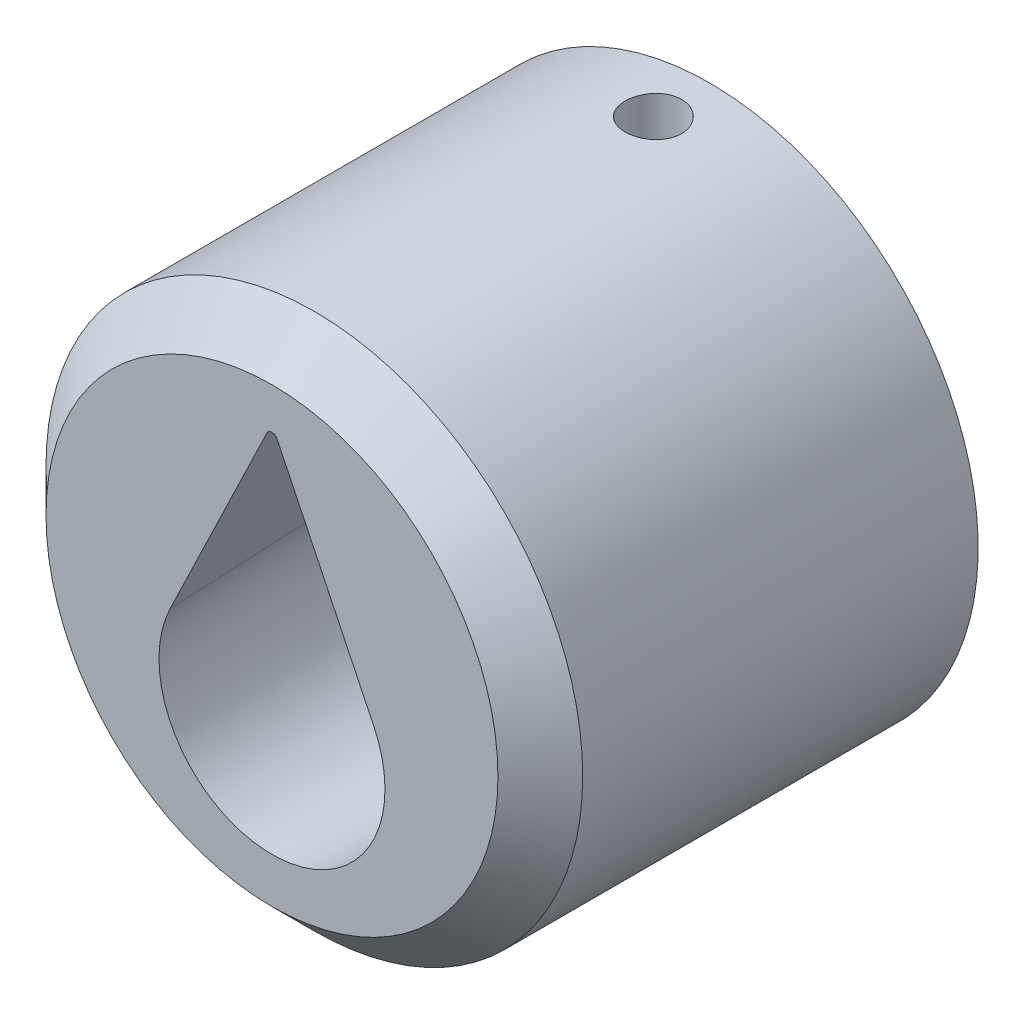
ISO-10303-21;
HEADER;
FILE_DESCRIPTION(('STEP AP214'),'2;1');
FILE_NAME('part.step','',(''),(''),'','','');
FILE_SCHEMA(('AUTOMOTIVE_DESIGN { 1 0 10303 214 1 1 1 1 }'));
ENDSEC;
DATA;
#1=APPLICATION_CONTEXT('core data for automotive mechanical design processes');
#2=APPLICATION_PROTOCOL_DEFINITION('international standard','automotive_design',2000,#1);
#3=PRODUCT_CONTEXT('',#1,'mechanical');
#4=PRODUCT('Part','Part','',(#3));
#5=PRODUCT_RELATED_PRODUCT_CATEGORY('part','',(#4));
#6=PRODUCT_DEFINITION_FORMATION('','',#4);
#7=PRODUCT_DEFINITION_CONTEXT('part definition',#1,'design');
#8=PRODUCT_DEFINITION('design','',#6,#7);
#9=PRODUCT_DEFINITION_SHAPE('','',#8);
#10=(LENGTH_UNIT() NAMED_UNIT(*) SI_UNIT(.MILLI.,.METRE.));
#11=(NAMED_UNIT(*) PLANE_ANGLE_UNIT() SI_UNIT($,.RADIAN.));
#12=(NAMED_UNIT(*) SI_UNIT($,.STERADIAN.) SOLID_ANGLE_UNIT());
#13=UNCERTAINTY_MEASURE_WITH_UNIT(LENGTH_MEASURE(1.E-05),#10,'distance_accuracy_value','');
#14=(GEOMETRIC_REPRESENTATION_CONTEXT(3) GLOBAL_UNCERTAINTY_ASSIGNED_CONTEXT((#13)) GLOBAL_UNIT_ASSIGNED_CONTEXT((#10,
#11,#12)) REPRESENTATION_CONTEXT('',''));
#15=CARTESIAN_POINT('',(0.,0.,0.));
#16=DIRECTION('',(0.,0.,1.));
#17=DIRECTION('',(1.,0.,0.));
#18=AXIS2_PLACEMENT_3D('',#15,#16,#17);
#19=CARTESIAN_POINT('',(0.,3.17,1.36960721857804));
#20=DIRECTION('',(0.,0.,-1.));
#21=DIRECTION('',(-1.,0.,0.));
#22=AXIS2_PLACEMENT_3D('',#19,#20,#21);
#23=CONICAL_SURFACE('',#22,0.322808225586613,0.0349065850402013);
#24=CARTESIAN_POINT('',(0.289503548245727,3.30977363021477,1.40766125098313));
#25=CARTESIAN_POINT('',(0.281010976513092,3.32683568107946,1.41370671628476));
#26=CARTESIAN_POINT('',(0.271109988403632,3.34295551904441,1.42032696377866));
#27=CARTESIAN_POINT('',(0.248677947118351,3.37316705283377,1.43396834605201));
#28=CARTESIAN_POINT('',(0.23613706423505,3.38725082710312,1.44099090564664));
#29=CARTESIAN_POINT('',(0.208686963801339,3.41310734779046,1.45462708367945));
#30=CARTESIAN_POINT('',(0.19377897678483,3.42488128790014,1.4612409121275));
#31=CARTESIAN_POINT('',(0.161828670976606,3.4457774367839,1.47339442192647));
#32=CARTESIAN_POINT('',(0.14478943054501,3.45490340838251,1.47893562373769));
#33=CARTESIAN_POINT('',(0.109787174966618,3.46973500877186,1.48811737903807));
#34=CARTESIAN_POINT('',(0.0919042756431988,3.47558027564039,1.49183450615142));
#35=CARTESIAN_POINT('',(0.0551141459244364,3.48410777679032,1.49729925035043));
#36=CARTESIAN_POINT('',(0.0362082275810521,3.48679396661385,1.49904933029241));
#37=CARTESIAN_POINT('',(0.00105415561990478,3.48865459959268,1.50026021785506));
#38=CARTESIAN_POINT('',(-0.0151603269913705,3.48830150558641,1.500029042902));
#39=CARTESIAN_POINT('',(-0.0472596223392381,3.48520850799322,1.4980209307988));
#40=CARTESIAN_POINT('',(-0.0631444788298692,3.48246892328709,1.49624420016449));
#41=CARTESIAN_POINT('',(-0.0935024984211748,3.47490907028782,1.49141063917163));
#42=CARTESIAN_POINT('',(-0.108006743525232,3.47017691547354,1.48840816650877));
#43=CARTESIAN_POINT('',(-0.135996248008937,3.45884924590151,1.48136631259266));
#44=CARTESIAN_POINT('',(-0.149481157363488,3.45225309472555,1.47732657723329));
#45=CARTESIAN_POINT('',(-0.176564619661506,3.43663116226765,1.46802845888353));
#46=CARTESIAN_POINT('',(-0.190029712699991,3.42742426952316,1.46268711128333));
#47=CARTESIAN_POINT('',(-0.215300524265339,3.40722350331987,1.45148322318052));
#48=CARTESIAN_POINT('',(-0.227105393976845,3.39622872192399,1.4456204185572));
#49=CARTESIAN_POINT('',(-0.248269037140414,3.37333656680272,1.4341635141443));
#50=CARTESIAN_POINT('',(-0.257732166477332,3.36153311924641,1.42857443525645));
#51=CARTESIAN_POINT('',(-0.27493565411919,3.33661476989699,1.41774996412032));
#52=CARTESIAN_POINT('',(-0.282678345520565,3.32350167955512,1.41251409967382));
#53=CARTESIAN_POINT('',(-0.289503548245727,3.30977363021477,1.40766125098313));
#54=B_SPLINE_CURVE_WITH_KNOTS('',3,(#24,#25,#26,#27,#28,#29,#30,#31,#32,#33,#34,#35,#36,#37,#38,
#39,#40,#41,#42,#43,#44,#45,#46,#47,#48,#49,#50,#51,#52,#53),.UNSPECIFIED.,.F.,.F.,(4,2,2,2,2,2,
2,2,2,2,2,2,2,2,4),(0.,0.0598633955449791,0.119953766602124,0.18001300147202,0.239986468051595,
0.297163591024114,0.354269044920385,0.402678805832384,0.45108209926652,0.497538681651625,
0.54401114476062,0.595306822489587,0.646628631338851,0.69486675846325,0.743039064822791),.UNSPECIFIED.);
#55=CARTESIAN_POINT('',(0.289503548246163,3.30977363021432,1.4076612509839));
#56=VERTEX_POINT('',#55);
#57=CARTESIAN_POINT('',(-0.289503548245974,3.30977363021456,1.40766125098296));
#58=VERTEX_POINT('',#57);
#59=EDGE_CURVE('E21',#56,#58,#54,.T.);
#60=ORIENTED_EDGE('',*,*,#59,.F.);
#61=DIRECTION('',(-0.0314282337055708,-0.0151736942184786,0.999390827019096));
#62=VECTOR('',#61,1.);
#63=CARTESIAN_POINT('',(0.0900535442487354,3.21347826086956,7.75));
#64=LINE('',#63,#62);
#65=CARTESIAN_POINT('',(0.0900535442489345,3.21347826086966,7.74999999999363));
#66=VERTEX_POINT('',#65);
#67=EDGE_CURVE('E79',#66,#56,#64,.F.);
#68=ORIENTED_EDGE('',*,*,#67,.F.);
#69=CARTESIAN_POINT('',(0.,3.17,7.74999999998727));
#70=DIRECTION('',(0.,0.,-1.));
#71=DIRECTION('',(-1.,0.,0.));
#72=AXIS2_PLACEMENT_3D('',#69,#70,#71);
#73=CIRCLE('',#72,0.0999999999981992);
#74=CARTESIAN_POINT('',(-0.0900535442489342,3.21347826086966,7.74999999999363));
#75=VERTEX_POINT('',#74);
#76=EDGE_CURVE('E178',#75,#66,#73,.T.);
#77=ORIENTED_EDGE('',*,*,#76,.F.);
#78=DIRECTION('',(0.0314282337055708,-0.0151736942184786,0.999390827019096));
#79=VECTOR('',#78,1.);
#80=CARTESIAN_POINT('',(-0.0900535442487341,3.21347826086956,7.75));
#81=LINE('',#80,#79);
#82=EDGE_CURVE('E83',#58,#75,#81,.T.);
#83=ORIENTED_EDGE('',*,*,#82,.F.);
#84=EDGE_LOOP('',(#60,#68,#77,#83));
#85=FACE_BOUND('',#84,.T.);
#86=ADVANCED_FACE('F17',(#85),#23,.F.);
#87=CARTESIAN_POINT('',(1.33122630628558,0.642722117202267,7.75));
#88=DIRECTION('',(-0.899986860627394,-0.434517750877867,-0.0348994967025009));
#89=DIRECTION('',(0.434782608695651,-0.900535442487304,0.));
#90=AXIS2_PLACEMENT_3D('',#87,#88,#89);
#91=PLANE('',#90);
#92=DIRECTION('',(0.434782608695653,-0.900535442487303,0.));
#93=VECTOR('',#92,1.);
#94=CARTESIAN_POINT('',(0.0900535442487305,3.21347826086956,7.75));
#95=LINE('',#94,#93);
#96=CARTESIAN_POINT('',(1.80107088497423,-0.330434782609057,7.75000000000466));
#97=VERTEX_POINT('',#96);
#98=EDGE_CURVE('E87',#66,#97,#95,.T.);
#99=ORIENTED_EDGE('',*,*,#98,.F.);
#100=ORIENTED_EDGE('',*,*,#67,.T.);
#101=CARTESIAN_POINT('',(0.,3.94214494635939,1.));
#102=DIRECTION('',(-0.899986860627394,-0.434517750877867,-0.0348994967025009));
#103=DIRECTION('',(0.434191423085883,-0.900663269025689,0.0168369815173485));
#104=AXIS2_PLACEMENT_3D('',#101,#102,#103);
#105=ELLIPSE('',#104,1.15070097594365,0.5);
#106=CARTESIAN_POINT('',(0.31454594570989,3.32186421364249,0.611334529358661));
#107=VERTEX_POINT('',#106);
#108=EDGE_CURVE('E72',#56,#107,#105,.F.);
#109=ORIENTED_EDGE('',*,*,#108,.T.);
#110=DIRECTION('',(-0.031428233705571,-0.0151736942184784,0.999390827019096));
#111=VECTOR('',#110,1.);
#112=CARTESIAN_POINT('',(15692.5816833393,7579.61983145452,-499000.));
#113=LINE('',#112,#111);
#114=CARTESIAN_POINT('',(0.333770821445696,3.33114607111328,2.8421709430404E-11));
#115=VERTEX_POINT('',#114);
#116=EDGE_CURVE('E176',#107,#115,#113,.F.);
#117=ORIENTED_EDGE('',*,*,#116,.T.);
#118=DIRECTION('',(0.434782608695651,-0.900535442487304,0.));
#119=VECTOR('',#118,1.);
#120=CARTESIAN_POINT('',(0.333770821447154,3.3311460711135,0.));
#121=LINE('',#120,#119);
#122=CARTESIAN_POINT('',(2.04478816217206,-0.212766972365798,4.2632564145606E-11));
#123=VERTEX_POINT('',#122);
#124=EDGE_CURVE('E170',#115,#123,#121,.T.);
#125=ORIENTED_EDGE('',*,*,#124,.T.);
#126=DIRECTION('',(-0.0314282337055709,-0.0151736942184787,0.999390827019096));
#127=VECTOR('',#126,1.);
#128=CARTESIAN_POINT('',(15694.29270068,7576.07591841115,-499000.));
#129=LINE('',#128,#127);
#130=EDGE_CURVE('E89',#123,#97,#129,.T.);
#131=ORIENTED_EDGE('',*,*,#130,.T.);
#132=EDGE_LOOP('',(#99,#100,#109,#117,#125,#131));
#133=FACE_BOUND('',#132,.T.);
#134=ADVANCED_FACE('F85',(#133),#91,.T.);
#135=CARTESIAN_POINT('',(0.,-1.2,1.70530256582424E-10));
#136=DIRECTION('',(0.,0.,-1.));
#137=DIRECTION('',(-1.,0.,0.));
#138=AXIS2_PLACEMENT_3D('',#135,#136,#137);
#139=CONICAL_SURFACE('',#138,2.27063596355492,0.0349065850402135);
#140=CARTESIAN_POINT('',(0.,-1.2,7.74999999998727));
#141=DIRECTION('',(0.,0.,-1.));
#142=DIRECTION('',(-1.,0.,0.));
#143=AXIS2_PLACEMENT_3D('',#140,#141,#142);
#144=CIRCLE('',#143,1.99999999999774);
#145=CARTESIAN_POINT('',(-1.80107088497481,-0.3304347826086,7.74999999999363));
#146=VERTEX_POINT('',#145);
#147=EDGE_CURVE('E91',#97,#146,#144,.T.);
#148=ORIENTED_EDGE('',*,*,#147,.F.);
#149=ORIENTED_EDGE('',*,*,#130,.F.);
#150=CARTESIAN_POINT('',(0.,-1.2,0.));
#151=DIRECTION('',(0.,0.,-1.));
#152=DIRECTION('',(-1.,0.,0.));
#153=AXIS2_PLACEMENT_3D('',#150,#151,#152);
#154=CIRCLE('',#153,2.27063596356088);
#155=CARTESIAN_POINT('',(-2.04478816217303,-0.212766972364764,0.));
#156=VERTEX_POINT('',#155);
#157=EDGE_CURVE('E184',#123,#156,#154,.T.);
#158=ORIENTED_EDGE('',*,*,#157,.T.);
#159=DIRECTION('',(0.0314282337055708,-0.0151736942184786,0.999390827019096));
#160=VECTOR('',#159,1.);
#161=CARTESIAN_POINT('',(-1.80107088497461,-0.330434782608697,7.75));
#162=LINE('',#161,#160);
#163=EDGE_CURVE('E97',#146,#156,#162,.F.);
#164=ORIENTED_EDGE('',*,*,#163,.F.);
#165=EDGE_LOOP('',(#148,#149,#158,#164));
#166=FACE_BOUND('',#165,.T.);
#167=ADVANCED_FACE('F135',(#166),#139,.F.);
#168=CARTESIAN_POINT('',(0.,0.,7.75));
#169=DIRECTION('',(0.,0.,1.));
#170=DIRECTION('',(1.,0.,0.));
#171=AXIS2_PLACEMENT_3D('',#168,#169,#170);
#172=PLANE('',#171);
#173=CARTESIAN_POINT('',(0.,0.,7.74999999993042));
#174=DIRECTION('',(0.,0.,-1.));
#175=DIRECTION('',(0.,1.,0.));
#176=AXIS2_PLACEMENT_3D('',#173,#174,#175);
#177=CIRCLE('',#176,4.0000000000191);
#178=CARTESIAN_POINT('',(0.,4.0000000000191,7.74999999993042));
#179=VERTEX_POINT('',#178);
#180=EDGE_CURVE('E123',#179,#179,#177,.T.);
#181=ORIENTED_EDGE('',*,*,#180,.F.);
#182=EDGE_LOOP('',(#181));
#183=FACE_BOUND('',#182,.T.);
#184=ORIENTED_EDGE('',*,*,#76,.T.);
#185=ORIENTED_EDGE('',*,*,#98,.T.);
#186=ORIENTED_EDGE('',*,*,#147,.T.);
#187=DIRECTION('',(0.434782608695651,0.900535442487304,0.));
#188=VECTOR('',#187,1.);
#189=CARTESIAN_POINT('',(-1.33122630628558,0.642722117202267,7.75));
#190=LINE('',#189,#188);
#191=EDGE_CURVE('E95',#75,#146,#190,.F.);
#192=ORIENTED_EDGE('',*,*,#191,.F.);
#193=EDGE_LOOP('',(#184,#185,#186,#192));
#194=FACE_BOUND('',#193,.T.);
#195=ADVANCED_FACE('F132',(#183,#194),#172,.T.);
#196=CARTESIAN_POINT('',(0.,3.17,5.6843418860808E-11));
#197=DIRECTION('',(0.,0.,-1.));
#198=DIRECTION('',(-1.,0.,0.));
#199=AXIS2_PLACEMENT_3D('',#196,#197,#198);
#200=CONICAL_SURFACE('',#199,0.370635963559351,0.0349065850454829);
#201=CARTESIAN_POINT('',(0.314545945704039,3.3218642136344,0.611334529401599));
#202=CARTESIAN_POINT('',(0.305573032987296,3.34097189299431,0.604053578384631));
#203=CARTESIAN_POINT('',(0.295057113810149,3.35905275615068,0.596073382946094));
#204=CARTESIAN_POINT('',(0.27104591609445,3.39305279454655,0.57959215387822));
#205=CARTESIAN_POINT('',(0.257531832809411,3.40895725332386,0.571088089111343));
#206=CARTESIAN_POINT('',(0.227748138728409,3.43824718672275,0.55455308858503));
#207=CARTESIAN_POINT('',(0.211477901884666,3.45163208757657,0.54652226087911));
#208=CARTESIAN_POINT('',(0.176405606119682,3.47541433228028,0.531769323904325));
#209=CARTESIAN_POINT('',(0.157612107329941,3.48582141999117,0.525042970030462));
#210=CARTESIAN_POINT('',(0.122757586932063,3.50099903583823,0.515051863708642));
#211=CARTESIAN_POINT('',(0.107152166643877,3.50652558244096,0.511342847177409));
#212=CARTESIAN_POINT('',(0.0750439317356073,3.51531836048673,0.505394938228743));
#213=CARTESIAN_POINT('',(0.0585415902383202,3.5185857713712,0.503155278725961));
#214=CARTESIAN_POINT('',(0.0250351482919738,3.52268044507448,0.500343375911319));
#215=CARTESIAN_POINT('',(0.00802953174006788,3.52349936799548,0.499776831547492));
#216=CARTESIAN_POINT('',(-0.0258855981944758,3.52262048980704,0.500382600716811));
#217=CARTESIAN_POINT('',(-0.0427951080613607,3.52092259721533,0.50155497745699));
#218=CARTESIAN_POINT('',(-0.0750832803428299,3.51527678226081,0.505416594377751));
#219=CARTESIAN_POINT('',(-0.0904951681359494,3.51145637583422,0.508019787159319));
#220=CARTESIAN_POINT('',(-0.120410227209274,3.50185025864438,0.514473734974771));
#221=CARTESIAN_POINT('',(-0.134913320338144,3.49606437913524,0.518324597126125));
#222=CARTESIAN_POINT('',(-0.163915701778143,3.48220140795525,0.527367975381033));
#223=CARTESIAN_POINT('',(-0.178316817042999,3.47397514858403,0.532644715760923));
#224=CARTESIAN_POINT('',(-0.205607736863133,3.45573700464584,0.54399081778114));
#225=CARTESIAN_POINT('',(-0.218495632489218,3.44572290399341,0.550061160587517));
#226=CARTESIAN_POINT('',(-0.244783569834706,3.42221186377407,0.563723207699263));
#227=CARTESIAN_POINT('',(-0.257871342151368,3.40841218093046,0.571394146064251));
#228=CARTESIAN_POINT('',(-0.281661514448459,3.37888012105428,0.586641305571118));
#229=CARTESIAN_POINT('',(-0.292368070802405,3.36315118717353,0.594217669614988));
#230=CARTESIAN_POINT('',(-0.306348904893403,3.33851106416141,0.604799248510523));
#231=CARTESIAN_POINT('',(-0.310600856223641,3.33028723321938,0.608139917258041));
#232=CARTESIAN_POINT('',(-0.314545945707717,3.32186421364054,0.611334529397092));
#233=B_SPLINE_CURVE_WITH_KNOTS('',3,(#201,#202,#203,#204,#205,#206,#207,#208,#209,#210,#211,
#212,#213,#214,#215,#216,#217,#218,#219,#220,#221,#222,#223,#224,#225,#226,#227,#228,#229,#230,
#231,#232),.UNSPECIFIED.,.F.,.F.,(4,2,2,2,2,2,2,2,2,2,2,2,2,2,2,4),(0.,0.066865726050192,
0.134163332525763,0.201476245895274,0.268566314195754,0.319250659129264,0.369908522941487,
0.420738739173469,0.471570803048701,0.519635731199051,0.56770478701211,0.619722405176195,
0.671804954225197,0.733095233085949,0.794277676193224,0.823777302839765),.UNSPECIFIED.);
#234=CARTESIAN_POINT('',(-0.314545945708815,3.32186421364145,0.611334529398164));
#235=VERTEX_POINT('',#234);
#236=EDGE_CURVE('E41',#107,#235,#233,.T.);
#237=ORIENTED_EDGE('',*,*,#236,.T.);
#238=DIRECTION('',(0.0314282337055708,-0.0151736942184786,0.999390827019096));
#239=VECTOR('',#238,1.);
#240=CARTESIAN_POINT('',(-0.0900535442487323,3.21347826086957,7.75));
#241=LINE('',#240,#239);
#242=CARTESIAN_POINT('',(-0.333770821447155,3.3311460711135,0.));
#243=VERTEX_POINT('',#242);
#244=EDGE_CURVE('E162',#243,#235,#241,.T.);
#245=ORIENTED_EDGE('',*,*,#244,.F.);
#246=CARTESIAN_POINT('',(0.,3.17,0.));
#247=DIRECTION('',(0.,0.,-1.));
#248=DIRECTION('',(-1.,0.,0.));
#249=AXIS2_PLACEMENT_3D('',#246,#247,#248);
#250=CIRCLE('',#249,0.370635963561336);
#251=EDGE_CURVE('E168',#243,#115,#250,.T.);
#252=ORIENTED_EDGE('',*,*,#251,.T.);
#253=ORIENTED_EDGE('',*,*,#116,.F.);
#254=EDGE_LOOP('',(#237,#245,#252,#253));
#255=FACE_BOUND('',#254,.T.);
#256=ADVANCED_FACE('F126',(#255),#200,.F.);
#257=CARTESIAN_POINT('',(-1.33122630628558,0.642722117202267,7.75));
#258=DIRECTION('',(0.899986860627394,-0.434517750877867,-0.0348994967025009));
#259=DIRECTION('',(0.434782608695651,0.900535442487304,0.));
#260=AXIS2_PLACEMENT_3D('',#257,#258,#259);
#261=PLANE('',#260);
#262=DIRECTION('',(0.434782608695652,0.900535442487304,0.));
#263=VECTOR('',#262,1.);
#264=CARTESIAN_POINT('',(-2.04478816217303,-0.212766972364763,0.));
#265=LINE('',#264,#263);
#266=EDGE_CURVE('E165',#156,#243,#265,.T.);
#267=ORIENTED_EDGE('',*,*,#266,.T.);
#268=ORIENTED_EDGE('',*,*,#244,.T.);
#269=CARTESIAN_POINT('',(0.,3.94214494635939,1.));
#270=DIRECTION('',(0.899986860627394,-0.434517750877867,-0.0348994967025009));
#271=DIRECTION('',(-0.434191423085883,-0.900663269025689,0.0168369815173485));
#272=AXIS2_PLACEMENT_3D('',#269,#270,#271);
#273=ELLIPSE('',#272,1.15070097594365,0.5);
#274=EDGE_CURVE('E122',#235,#58,#273,.F.);
#275=ORIENTED_EDGE('',*,*,#274,.T.);
#276=ORIENTED_EDGE('',*,*,#82,.T.);
#277=ORIENTED_EDGE('',*,*,#191,.T.);
#278=ORIENTED_EDGE('',*,*,#163,.T.);
#279=EDGE_LOOP('',(#267,#268,#275,#276,#277,#278));
#280=FACE_BOUND('',#279,.T.);
#281=ADVANCED_FACE('F131',(#280),#261,.T.);
#282=CARTESIAN_POINT('',(0.,0.,0.));
#283=DIRECTION('',(0.,0.,1.));
#284=DIRECTION('',(1.,0.,0.));
#285=AXIS2_PLACEMENT_3D('',#282,#283,#284);
#286=PLANE('',#285);
#287=ORIENTED_EDGE('',*,*,#157,.F.);
#288=ORIENTED_EDGE('',*,*,#124,.F.);
#289=ORIENTED_EDGE('',*,*,#251,.F.);
#290=ORIENTED_EDGE('',*,*,#266,.F.);
#291=EDGE_LOOP('',(#287,#288,#289,#290));
#292=FACE_BOUND('',#291,.T.);
#293=CARTESIAN_POINT('',(0.,0.,0.));
#294=DIRECTION('',(0.,0.,-1.));
#295=DIRECTION('',(-1.,0.,0.));
#296=AXIS2_PLACEMENT_3D('',#293,#294,#295);
#297=CIRCLE('',#296,4.75);
#298=CARTESIAN_POINT('',(-4.75,0.,0.));
#299=VERTEX_POINT('',#298);
#300=EDGE_CURVE('E155',#299,#299,#297,.F.);
#301=ORIENTED_EDGE('',*,*,#300,.F.);
#302=EDGE_LOOP('',(#301));
#303=FACE_BOUND('',#302,.T.);
#304=ADVANCED_FACE('F192',(#292,#303),#286,.F.);
#305=CARTESIAN_POINT('',(0.,0.,6.99999999994816));
#306=DIRECTION('',(0.,0.,-1.));
#307=DIRECTION('',(0.,1.,0.));
#308=AXIS2_PLACEMENT_3D('',#305,#306,#307);
#309=CONICAL_SURFACE('',#308,4.75000000000136,0.785398163397448);
#310=ORIENTED_EDGE('',*,*,#180,.T.);
#311=EDGE_LOOP('',(#310));
#312=FACE_BOUND('',#311,.T.);
#313=CARTESIAN_POINT('',(0.,0.,7.));
#314=DIRECTION('',(0.,0.,-1.));
#315=DIRECTION('',(-1.,0.,0.));
#316=AXIS2_PLACEMENT_3D('',#313,#314,#315);
#317=CIRCLE('',#316,4.75);
#318=CARTESIAN_POINT('',(-4.75,0.,7.));
#319=VERTEX_POINT('',#318);
#320=EDGE_CURVE('E32',#319,#319,#317,.T.);
#321=ORIENTED_EDGE('',*,*,#320,.F.);
#322=EDGE_LOOP('',(#321));
#323=FACE_BOUND('',#322,.T.);
#324=ADVANCED_FACE('F109',(#312,#323),#309,.T.);
#325=CARTESIAN_POINT('',(0.,19.0707581171369,1.));
#326=DIRECTION('',(0.,-1.,0.));
#327=DIRECTION('',(0.,0.,-1.));
#328=AXIS2_PLACEMENT_3D('',#325,#326,#327);
#329=CYLINDRICAL_SURFACE('',#328,0.5);
#330=CARTESIAN_POINT('',(-0.353214084180559,4.73684914375965,1.35389237168451));
#331=CARTESIAN_POINT('',(-0.333350968148456,4.73833015064084,1.37371579279254));
#332=CARTESIAN_POINT('',(-0.311802354077412,4.73981087129126,1.39187632148008));
#333=CARTESIAN_POINT('',(-0.265940085437879,4.74260515391572,1.42434281337594));
#334=CARTESIAN_POINT('',(-0.241623478274562,4.74391853416482,1.43864460466638));
#335=CARTESIAN_POINT('',(-0.190925558899024,4.74622905851858,1.46296580491036));
#336=CARTESIAN_POINT('',(-0.164544746874962,4.7472262789395,1.47298624752099));
#337=CARTESIAN_POINT('',(-0.110469715950688,4.74879220490676,1.48845384174608));
#338=CARTESIAN_POINT('',(-0.0827758285058797,4.74936101798889,1.49390214106696));
#339=CARTESIAN_POINT('',(-0.0269578674609649,4.7500051991182,1.50005888720328));
#340=CARTESIAN_POINT('',(0.0011643763452334,4.7500822753923,1.50078374280908));
#341=CARTESIAN_POINT('',(0.0571309191822832,4.74973886284661,1.49751564040214));
#342=CARTESIAN_POINT('',(0.084975211839724,4.74931836264371,1.49352257445706));
#343=CARTESIAN_POINT('',(0.139529284025657,4.74802851599114,1.48095048074503));
#344=CARTESIAN_POINT('',(0.166241525333746,4.74716020397599,1.4723820204215));
#345=CARTESIAN_POINT('',(0.217849540208262,4.74507209688697,1.45091319421633));
#346=CARTESIAN_POINT('',(0.242745272697635,4.74385229386784,1.43801273041121));
#347=CARTESIAN_POINT('',(0.290115364487072,4.7411916994472,1.40819029023061));
#348=CARTESIAN_POINT('',(0.312580375871146,4.73975010318313,1.391253538539));
#349=CARTESIAN_POINT('',(0.354356647480779,4.73681019089902,1.35386055130534));
#350=CARTESIAN_POINT('',(0.373667826078985,4.73531187341217,1.33340422469795));
#351=CARTESIAN_POINT('',(0.40866646209496,4.73242032990214,1.2894545664668));
#352=CARTESIAN_POINT('',(0.424339154274021,4.73102754702109,1.26594944350235));
#353=CARTESIAN_POINT('',(0.451514433596426,4.72851157988619,1.21662748571767));
#354=CARTESIAN_POINT('',(0.463017075357155,4.72738839210137,1.1908106811803));
#355=CARTESIAN_POINT('',(0.481500975792717,4.7255416112885,1.13764883558995));
#356=CARTESIAN_POINT('',(0.488491014280388,4.72481724271643,1.11030687526091));
#357=CARTESIAN_POINT('',(0.497779748932857,4.72384774145372,1.05482937646673));
#358=CARTESIAN_POINT('',(0.500078605477187,4.72360259237979,1.02669386516442));
#359=CARTESIAN_POINT('',(0.499917673592958,4.72361961535894,0.970574757718369));
#360=CARTESIAN_POINT('',(0.497481095377007,4.72387931296316,0.942591091369234));
#361=CARTESIAN_POINT('',(0.487967138673642,4.72487149226908,0.887433092684714));
#362=CARTESIAN_POINT('',(0.480889761040639,4.72560397388373,0.860258760200324));
#363=CARTESIAN_POINT('',(0.462301678806832,4.7274584879864,0.807491472591667));
#364=CARTESIAN_POINT('',(0.450791743694633,4.72858045285709,0.781898243883361));
#365=CARTESIAN_POINT('',(0.423667196732065,4.73108770000512,0.733002218380797));
#366=CARTESIAN_POINT('',(0.408052452928492,4.73247299074695,0.709699495250237));
#367=CARTESIAN_POINT('',(0.373072541463566,4.73535906001818,0.665925808716378));
#368=CARTESIAN_POINT('',(0.353689694971219,4.73686036200942,0.645469005683883));
#369=CARTESIAN_POINT('',(0.311765402695952,4.73980410991302,0.608093111442153));
#370=CARTESIAN_POINT('',(0.289223907243638,4.74124655489941,0.591174075874338));
#371=CARTESIAN_POINT('',(0.241557462799136,4.7439140202418,0.561317138796633));
#372=CARTESIAN_POINT('',(0.216426679208004,4.74513853181528,0.548388502876861));
#373=CARTESIAN_POINT('',(0.16433574338095,4.74722787376358,0.52693859412066));
#374=CARTESIAN_POINT('',(0.137375639658117,4.74809271367245,0.518417204456853));
#375=CARTESIAN_POINT('',(0.082498733842945,4.74936248618811,0.506054594480822));
#376=CARTESIAN_POINT('',(0.0545859014775292,4.74976913245193,0.50219593148977));
#377=CARTESIAN_POINT('',(-0.00149398639063508,4.75008251105097,0.499214438805158));
#378=CARTESIAN_POINT('',(-0.0296610352384544,4.74998925643503,0.500091485496182));
#379=CARTESIAN_POINT('',(-0.085332914037542,4.74931473919156,0.506542316414699));
#380=CARTESIAN_POINT('',(-0.112839914074084,4.74873539876205,0.512097601141002));
#381=CARTESIAN_POINT('',(-0.166528940922625,4.74715597819485,0.52771853997639));
#382=CARTESIAN_POINT('',(-0.192710951189041,4.74615589280463,0.537784250393179));
#383=CARTESIAN_POINT('',(-0.243066261710115,4.7438440137321,0.562161182459306));
#384=CARTESIAN_POINT('',(-0.267235493026433,4.7425316083837,0.576480748953908));
#385=CARTESIAN_POINT('',(-0.312834767760387,4.73974230101966,0.608952806515943));
#386=CARTESIAN_POINT('',(-0.334264716690939,4.73826539333305,0.627105429741182));
#387=CARTESIAN_POINT('',(-0.373885720283401,4.73530431278017,0.666832974746514));
#388=CARTESIAN_POINT('',(-0.392060597000898,4.73382013934724,0.688424034920419));
#389=CARTESIAN_POINT('',(-0.424530502761783,4.7310189494288,0.734359388924333));
#390=CARTESIAN_POINT('',(-0.438825520297059,4.72970193343911,0.758703690920472));
#391=CARTESIAN_POINT('',(-0.463129634892443,4.72738413460409,0.809466599527028));
#392=CARTESIAN_POINT('',(-0.473137773110806,4.72638342251923,0.835885668636374));
#393=CARTESIAN_POINT('',(-0.488571099462968,4.7248131179288,0.890041267337517));
#394=CARTESIAN_POINT('',(-0.493996601313321,4.7242434959121,0.917777706607912));
#395=CARTESIAN_POINT('',(-0.500090464386265,4.72360233815267,0.973636271096381));
#396=CARTESIAN_POINT('',(-0.500781968415383,4.72352837932893,1.00175584565966));
#397=CARTESIAN_POINT('',(-0.497447942916889,4.72388063290403,1.05771720792377));
#398=CARTESIAN_POINT('',(-0.493421442825665,4.72430694821673,1.08555893727927));
#399=CARTESIAN_POINT('',(-0.480782243886666,4.72560983334987,1.14011157080981));
#400=CARTESIAN_POINT('',(-0.472178195554558,4.72648555378759,1.16682450570569));
#401=CARTESIAN_POINT('',(-0.450641945429346,4.72858731715238,1.2184065804546));
#402=CARTESIAN_POINT('',(-0.437714267162396,4.72981299374838,1.24327761428597));
#403=CARTESIAN_POINT('',(-0.41288151927347,4.73203208598812,1.28262386779418));
#404=CARTESIAN_POINT('',(-0.402068688235102,4.73296698975069,1.29780359540688));
#405=CARTESIAN_POINT('',(-0.378822449985886,4.73488435207429,1.32686354015251));
#406=CARTESIAN_POINT('',(-0.366389034416841,4.73586681088057,1.34074375058252));
#407=CARTESIAN_POINT('',(-0.353214084180559,4.73684914375965,1.35389237168451));
#408=B_SPLINE_CURVE_WITH_KNOTS('',3,(#330,#331,#332,#333,#334,#335,#336,#337,#338,#339,#340,
#341,#342,#343,#344,#345,#346,#347,#348,#349,#350,#351,#352,#353,#354,#355,#356,#357,#358,#359,
#360,#361,#362,#363,#364,#365,#366,#367,#368,#369,#370,#371,#372,#373,#374,#375,#376,#377,#378,
#379,#380,#381,#382,#383,#384,#385,#386,#387,#388,#389,#390,#391,#392,#393,#394,#395,#396,#397,
#398,#399,#400,#401,#402,#403,#404,#405,#406,#407),.UNSPECIFIED.,.T.,.F.,(4,2,2,2,2,2,2,2,2,2,2,
2,2,2,2,2,2,2,2,2,2,2,2,2,2,2,2,2,2,2,2,2,2,2,2,2,2,2,4),(0.,0.0842375607994005,
0.168565834330336,0.252873736747626,0.337160469730482,0.421154241881691,0.50514993560354,
0.588952464625432,0.672756888102576,0.756872931912833,0.840991152465676,0.925444985910201,
1.00989771317763,1.09418562830926,1.17847066180403,1.26234362318348,1.34621656912118,
1.43007496133798,1.51393604959686,1.59820052265337,1.68246632090784,1.76692633490522,
1.85138410991999,1.9355249510011,2.01966359577892,2.10347107881186,2.18727960811821,
2.2712536437894,2.35523057522699,2.43961394737954,2.52399756982021,2.60840005641302,
2.69279676454083,2.776780591129,2.86078169747288,2.94462462194399,3.02838010013177,
3.08425350617837,3.1401272004046),.UNSPECIFIED.);
#409=CARTESIAN_POINT('',(-0.353214084180559,4.73684914375965,1.35389237168451));
#410=VERTEX_POINT('',#409);
#411=EDGE_CURVE('E11',#410,#410,#408,.F.);
#412=ORIENTED_EDGE('',*,*,#411,.F.);
#413=EDGE_LOOP('',(#412));
#414=FACE_BOUND('',#413,.T.);
#415=ORIENTED_EDGE('',*,*,#236,.F.);
#416=ORIENTED_EDGE('',*,*,#108,.F.);
#417=ORIENTED_EDGE('',*,*,#59,.T.);
#418=ORIENTED_EDGE('',*,*,#274,.F.);
#419=EDGE_LOOP('',(#415,#416,#417,#418));
#420=FACE_BOUND('',#419,.T.);
#421=ADVANCED_FACE('F74',(#414,#420),#329,.F.);
#422=CARTESIAN_POINT('',(0.,0.,7.75));
#423=DIRECTION('',(0.,0.,-1.));
#424=DIRECTION('',(-1.,0.,0.));
#425=AXIS2_PLACEMENT_3D('',#422,#423,#424);
#426=CYLINDRICAL_SURFACE('',#425,4.75);
#427=ORIENTED_EDGE('',*,*,#411,.T.);
#428=EDGE_LOOP('',(#427));
#429=FACE_BOUND('',#428,.T.);
#430=ORIENTED_EDGE('',*,*,#320,.T.);
#431=EDGE_LOOP('',(#430));
#432=FACE_BOUND('',#431,.T.);
#433=ORIENTED_EDGE('',*,*,#300,.T.);
#434=EDGE_LOOP('',(#433));
#435=FACE_BOUND('',#434,.T.);
#436=ADVANCED_FACE('F104',(#429,#432,#435),#426,.T.);
#437=CLOSED_SHELL('',(#86,#134,#167,#195,#256,#281,#304,#324,#421,#436));
#438=MANIFOLD_SOLID_BREP('B1',#437);
#439=ADVANCED_BREP_SHAPE_REPRESENTATION('',(#18,#438),#14);
#440=SHAPE_DEFINITION_REPRESENTATION(#9,#439);
ENDSEC;
END-ISO-10303-21;
